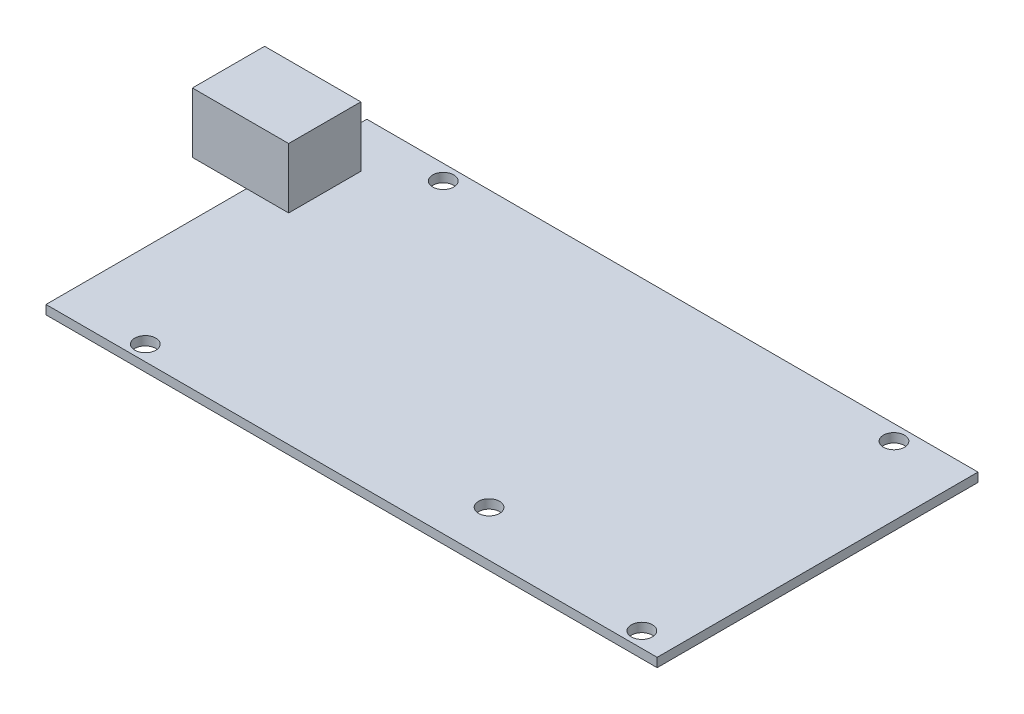
ISO-10303-21;
HEADER;
FILE_DESCRIPTION(('STEP AP214'),'2;1');
FILE_NAME('part.step','',(''),(''),'','','');
FILE_SCHEMA(('AUTOMOTIVE_DESIGN { 1 0 10303 214 1 1 1 1 }'));
ENDSEC;
DATA;
#1=APPLICATION_CONTEXT('core data for automotive mechanical design processes');
#2=APPLICATION_PROTOCOL_DEFINITION('international standard','automotive_design',2000,#1);
#3=PRODUCT_CONTEXT('',#1,'mechanical');
#4=PRODUCT('Part','Part','',(#3));
#5=PRODUCT_RELATED_PRODUCT_CATEGORY('part','',(#4));
#6=PRODUCT_DEFINITION_FORMATION('','',#4);
#7=PRODUCT_DEFINITION_CONTEXT('part definition',#1,'design');
#8=PRODUCT_DEFINITION('design','',#6,#7);
#9=PRODUCT_DEFINITION_SHAPE('','',#8);
#10=(LENGTH_UNIT() NAMED_UNIT(*) SI_UNIT(.MILLI.,.METRE.));
#11=(NAMED_UNIT(*) PLANE_ANGLE_UNIT() SI_UNIT($,.RADIAN.));
#12=(NAMED_UNIT(*) SI_UNIT($,.STERADIAN.) SOLID_ANGLE_UNIT());
#13=UNCERTAINTY_MEASURE_WITH_UNIT(LENGTH_MEASURE(1.E-05),#10,'distance_accuracy_value','');
#14=(GEOMETRIC_REPRESENTATION_CONTEXT(3) GLOBAL_UNCERTAINTY_ASSIGNED_CONTEXT((#13)) GLOBAL_UNIT_ASSIGNED_CONTEXT((#10,
#11,#12)) REPRESENTATION_CONTEXT('',''));
#15=CARTESIAN_POINT('',(0.,0.,0.));
#16=DIRECTION('',(0.,0.,1.));
#17=DIRECTION('',(1.,0.,0.));
#18=AXIS2_PLACEMENT_3D('',#15,#16,#17);
#19=CARTESIAN_POINT('',(0.,1.5,0.));
#20=DIRECTION('',(0.,-1.,0.));
#21=DIRECTION('',(0.,0.,-1.));
#22=AXIS2_PLACEMENT_3D('',#19,#20,#21);
#23=PLANE('',#22);
#24=CARTESIAN_POINT('',(54.1763414634146,1.5,-29.4784552845528));
#25=DIRECTION('',(0.,1.,0.));
#26=DIRECTION('',(0.,0.,1.));
#27=AXIS2_PLACEMENT_3D('',#24,#25,#26);
#28=CIRCLE('',#27,1.75);
#29=CARTESIAN_POINT('',(54.1763414634146,1.5,-27.7284552845528));
#30=VERTEX_POINT('',#29);
#31=EDGE_CURVE('E466',#30,#30,#28,.T.);
#32=ORIENTED_EDGE('',*,*,#31,.F.);
#33=EDGE_LOOP('',(#32));
#34=FACE_BOUND('',#33,.T.);
#35=CARTESIAN_POINT('',(-22.0236585365854,1.5,18.7815447154472));
#36=DIRECTION('',(0.,1.,0.));
#37=DIRECTION('',(0.,0.,1.));
#38=AXIS2_PLACEMENT_3D('',#35,#36,#37);
#39=CIRCLE('',#38,1.75);
#40=CARTESIAN_POINT('',(-22.0236585365854,1.5,20.5315447154472));
#41=VERTEX_POINT('',#40);
#42=EDGE_CURVE('E455',#41,#41,#39,.T.);
#43=ORIENTED_EDGE('',*,*,#42,.F.);
#44=EDGE_LOOP('',(#43));
#45=FACE_BOUND('',#44,.T.);
#46=CARTESIAN_POINT('',(30.0463414634146,1.5,13.7015447154472));
#47=DIRECTION('',(0.,1.,0.));
#48=DIRECTION('',(0.,0.,1.));
#49=AXIS2_PLACEMENT_3D('',#46,#47,#48);
#50=CIRCLE('',#49,1.75);
#51=CARTESIAN_POINT('',(30.0463414634146,1.5,15.4515447154472));
#52=VERTEX_POINT('',#51);
#53=EDGE_CURVE('E451',#52,#52,#50,.T.);
#54=ORIENTED_EDGE('',*,*,#53,.F.);
#55=EDGE_LOOP('',(#54));
#56=FACE_BOUND('',#55,.T.);
#57=CARTESIAN_POINT('',(60.5263414634146,1.5,18.7815447154472));
#58=DIRECTION('',(0.,1.,0.));
#59=DIRECTION('',(0.,0.,1.));
#60=AXIS2_PLACEMENT_3D('',#57,#58,#59);
#61=CIRCLE('',#60,1.75);
#62=CARTESIAN_POINT('',(60.5263414634146,1.5,20.5315447154472));
#63=VERTEX_POINT('',#62);
#64=EDGE_CURVE('E458',#63,#63,#61,.T.);
#65=ORIENTED_EDGE('',*,*,#64,.F.);
#66=EDGE_LOOP('',(#65));
#67=FACE_BOUND('',#66,.T.);
#68=CARTESIAN_POINT('',(-20.7536585365854,1.5,-29.4784552845528));
#69=DIRECTION('',(0.,1.,0.));
#70=DIRECTION('',(0.,0.,1.));
#71=AXIS2_PLACEMENT_3D('',#68,#69,#70);
#72=CIRCLE('',#71,1.75);
#73=CARTESIAN_POINT('',(-20.7536585365854,1.5,-27.7284552845528));
#74=VERTEX_POINT('',#73);
#75=EDGE_CURVE('E200',#74,#74,#72,.T.);
#76=ORIENTED_EDGE('',*,*,#75,.F.);
#77=EDGE_LOOP('',(#76));
#78=FACE_BOUND('',#77,.T.);
#79=DIRECTION('',(1.,0.,0.));
#80=VECTOR('',#79,1.);
#81=CARTESIAN_POINT('',(-44.9936585365854,1.5,-12.0184552845528));
#82=LINE('',#81,#80);
#83=CARTESIAN_POINT('',(-35.9936585365854,1.5,-12.0184552845528));
#84=VERTEX_POINT('',#83);
#85=CARTESIAN_POINT('',(-28.9936585365854,1.5,-12.0184552845528));
#86=VERTEX_POINT('',#85);
#87=EDGE_CURVE('E11',#84,#86,#82,.T.);
#88=ORIENTED_EDGE('',*,*,#87,.F.);
#89=DIRECTION('',(0.,0.,1.));
#90=VECTOR('',#89,1.);
#91=CARTESIAN_POINT('',(-35.9936585365854,1.5,21.3215447154472));
#92=LINE('',#91,#90);
#93=CARTESIAN_POINT('',(-35.9936585365854,1.5,21.3215447154472));
#94=VERTEX_POINT('',#93);
#95=EDGE_CURVE('E294',#84,#94,#92,.T.);
#96=ORIENTED_EDGE('',*,*,#95,.T.);
#97=DIRECTION('',(1.,0.,0.));
#98=VECTOR('',#97,1.);
#99=CARTESIAN_POINT('',(-35.9936585365854,1.5,21.3215447154472));
#100=LINE('',#99,#98);
#101=CARTESIAN_POINT('',(65.6063414634146,1.5,21.3215447154472));
#102=VERTEX_POINT('',#101);
#103=EDGE_CURVE('E292',#94,#102,#100,.T.);
#104=ORIENTED_EDGE('',*,*,#103,.T.);
#105=DIRECTION('',(0.,0.,-1.));
#106=VECTOR('',#105,1.);
#107=CARTESIAN_POINT('',(65.6063414634146,1.5,21.3215447154472));
#108=LINE('',#107,#106);
#109=CARTESIAN_POINT('',(65.6063414634146,1.5,-32.0184552845528));
#110=VERTEX_POINT('',#109);
#111=EDGE_CURVE('E296',#102,#110,#108,.T.);
#112=ORIENTED_EDGE('',*,*,#111,.T.);
#113=DIRECTION('',(-1.,0.,0.));
#114=VECTOR('',#113,1.);
#115=CARTESIAN_POINT('',(-35.9936585365854,1.5,-32.0184552845528));
#116=LINE('',#115,#114);
#117=CARTESIAN_POINT('',(-35.9936585365854,1.5,-32.0184552845528));
#118=VERTEX_POINT('',#117);
#119=EDGE_CURVE('E298',#110,#118,#116,.T.);
#120=ORIENTED_EDGE('',*,*,#119,.T.);
#121=CARTESIAN_POINT('',(-35.9936585365854,1.5,-24.0184552845528));
#122=VERTEX_POINT('',#121);
#123=EDGE_CURVE('E289',#118,#122,#92,.T.);
#124=ORIENTED_EDGE('',*,*,#123,.T.);
#125=DIRECTION('',(1.,0.,0.));
#126=VECTOR('',#125,1.);
#127=CARTESIAN_POINT('',(-44.9936585365854,1.5,-24.0184552845528));
#128=LINE('',#127,#126);
#129=CARTESIAN_POINT('',(-28.9936585365854,1.5,-24.0184552845528));
#130=VERTEX_POINT('',#129);
#131=EDGE_CURVE('E44',#122,#130,#128,.T.);
#132=ORIENTED_EDGE('',*,*,#131,.T.);
#133=DIRECTION('',(0.,0.,1.));
#134=VECTOR('',#133,1.);
#135=CARTESIAN_POINT('',(-28.9936585365854,1.5,-24.0184552845528));
#136=LINE('',#135,#134);
#137=EDGE_CURVE('E273',#130,#86,#136,.T.);
#138=ORIENTED_EDGE('',*,*,#137,.T.);
#139=EDGE_LOOP('',(#88,#96,#104,#112,#120,#124,#132,#138));
#140=FACE_BOUND('',#139,.T.);
#141=ADVANCED_FACE('F35',(#34,#45,#56,#67,#78,#140),#23,.F.);
#142=CARTESIAN_POINT('',(-35.9936585365854,1.5,21.3215447154472));
#143=DIRECTION('',(1.,0.,0.));
#144=DIRECTION('',(0.,0.,-1.));
#145=AXIS2_PLACEMENT_3D('',#142,#143,#144);
#146=PLANE('',#145);
#147=DIRECTION('',(0.,0.,1.));
#148=VECTOR('',#147,1.);
#149=CARTESIAN_POINT('',(-35.9936585365854,0.,21.3215447154472));
#150=LINE('',#149,#148);
#151=CARTESIAN_POINT('',(-35.9936585365854,0.,-32.0184552845528));
#152=VERTEX_POINT('',#151);
#153=CARTESIAN_POINT('',(-35.9936585365854,0.,21.3215447154472));
#154=VERTEX_POINT('',#153);
#155=EDGE_CURVE('E288',#152,#154,#150,.T.);
#156=ORIENTED_EDGE('',*,*,#155,.T.);
#157=DIRECTION('',(0.,-1.,0.));
#158=VECTOR('',#157,1.);
#159=CARTESIAN_POINT('',(-35.9936585365854,1.5,21.3215447154472));
#160=LINE('',#159,#158);
#161=EDGE_CURVE('E39',#94,#154,#160,.T.);
#162=ORIENTED_EDGE('',*,*,#161,.F.);
#163=ORIENTED_EDGE('',*,*,#95,.F.);
#164=EDGE_CURVE('E293',#122,#84,#92,.T.);
#165=ORIENTED_EDGE('',*,*,#164,.F.);
#166=ORIENTED_EDGE('',*,*,#123,.F.);
#167=DIRECTION('',(0.,-1.,0.));
#168=VECTOR('',#167,1.);
#169=CARTESIAN_POINT('',(-35.9936585365854,1.5,-32.0184552845528));
#170=LINE('',#169,#168);
#171=EDGE_CURVE('E300',#118,#152,#170,.T.);
#172=ORIENTED_EDGE('',*,*,#171,.T.);
#173=EDGE_LOOP('',(#156,#162,#163,#165,#166,#172));
#174=FACE_BOUND('',#173,.T.);
#175=ADVANCED_FACE('F37',(#174),#146,.F.);
#176=CARTESIAN_POINT('',(-35.9936585365854,1.5,21.3215447154472));
#177=DIRECTION('',(0.,0.,-1.));
#178=DIRECTION('',(-1.,0.,0.));
#179=AXIS2_PLACEMENT_3D('',#176,#177,#178);
#180=PLANE('',#179);
#181=DIRECTION('',(1.,0.,0.));
#182=VECTOR('',#181,1.);
#183=CARTESIAN_POINT('',(-35.9936585365854,0.,21.3215447154472));
#184=LINE('',#183,#182);
#185=CARTESIAN_POINT('',(65.6063414634146,0.,21.3215447154472));
#186=VERTEX_POINT('',#185);
#187=EDGE_CURVE('E303',#154,#186,#184,.T.);
#188=ORIENTED_EDGE('',*,*,#187,.T.);
#189=DIRECTION('',(0.,-1.,0.));
#190=VECTOR('',#189,1.);
#191=CARTESIAN_POINT('',(65.6063414634146,1.5,21.3215447154472));
#192=LINE('',#191,#190);
#193=EDGE_CURVE('E313',#102,#186,#192,.T.);
#194=ORIENTED_EDGE('',*,*,#193,.F.);
#195=ORIENTED_EDGE('',*,*,#103,.F.);
#196=ORIENTED_EDGE('',*,*,#161,.T.);
#197=EDGE_LOOP('',(#188,#194,#195,#196));
#198=FACE_BOUND('',#197,.T.);
#199=ADVANCED_FACE('F338',(#198),#180,.F.);
#200=CARTESIAN_POINT('',(65.6063414634146,1.5,21.3215447154472));
#201=DIRECTION('',(-1.,0.,0.));
#202=DIRECTION('',(0.,0.,1.));
#203=AXIS2_PLACEMENT_3D('',#200,#201,#202);
#204=PLANE('',#203);
#205=DIRECTION('',(0.,0.,-1.));
#206=VECTOR('',#205,1.);
#207=CARTESIAN_POINT('',(65.6063414634146,0.,21.3215447154472));
#208=LINE('',#207,#206);
#209=CARTESIAN_POINT('',(65.6063414634146,0.,-32.0184552845528));
#210=VERTEX_POINT('',#209);
#211=EDGE_CURVE('E305',#186,#210,#208,.T.);
#212=ORIENTED_EDGE('',*,*,#211,.T.);
#213=DIRECTION('',(0.,-1.,0.));
#214=VECTOR('',#213,1.);
#215=CARTESIAN_POINT('',(65.6063414634146,1.5,-32.0184552845528));
#216=LINE('',#215,#214);
#217=EDGE_CURVE('E311',#110,#210,#216,.T.);
#218=ORIENTED_EDGE('',*,*,#217,.F.);
#219=ORIENTED_EDGE('',*,*,#111,.F.);
#220=ORIENTED_EDGE('',*,*,#193,.T.);
#221=EDGE_LOOP('',(#212,#218,#219,#220));
#222=FACE_BOUND('',#221,.T.);
#223=ADVANCED_FACE('F345',(#222),#204,.F.);
#224=CARTESIAN_POINT('',(-35.9936585365854,1.5,-32.0184552845528));
#225=DIRECTION('',(0.,0.,1.));
#226=DIRECTION('',(1.,0.,0.));
#227=AXIS2_PLACEMENT_3D('',#224,#225,#226);
#228=PLANE('',#227);
#229=DIRECTION('',(-1.,0.,0.));
#230=VECTOR('',#229,1.);
#231=CARTESIAN_POINT('',(-35.9936585365854,0.,-32.0184552845528));
#232=LINE('',#231,#230);
#233=EDGE_CURVE('E307',#210,#152,#232,.T.);
#234=ORIENTED_EDGE('',*,*,#233,.T.);
#235=ORIENTED_EDGE('',*,*,#171,.F.);
#236=ORIENTED_EDGE('',*,*,#119,.F.);
#237=ORIENTED_EDGE('',*,*,#217,.T.);
#238=EDGE_LOOP('',(#234,#235,#236,#237));
#239=FACE_BOUND('',#238,.T.);
#240=ADVANCED_FACE('F348',(#239),#228,.F.);
#241=CARTESIAN_POINT('',(0.,0.,0.));
#242=DIRECTION('',(0.,-1.,0.));
#243=DIRECTION('',(0.,0.,-1.));
#244=AXIS2_PLACEMENT_3D('',#241,#242,#243);
#245=PLANE('',#244);
#246=CARTESIAN_POINT('',(54.1763414634146,0.,-29.4784552845528));
#247=DIRECTION('',(0.,1.,0.));
#248=DIRECTION('',(0.,0.,1.));
#249=AXIS2_PLACEMENT_3D('',#246,#247,#248);
#250=CIRCLE('',#249,1.75);
#251=CARTESIAN_POINT('',(54.1763414634146,0.,-27.7284552845528));
#252=VERTEX_POINT('',#251);
#253=EDGE_CURVE('E463',#252,#252,#250,.T.);
#254=ORIENTED_EDGE('',*,*,#253,.T.);
#255=EDGE_LOOP('',(#254));
#256=FACE_BOUND('',#255,.T.);
#257=CARTESIAN_POINT('',(-22.0236585365854,0.,18.7815447154472));
#258=DIRECTION('',(0.,1.,0.));
#259=DIRECTION('',(0.,0.,1.));
#260=AXIS2_PLACEMENT_3D('',#257,#258,#259);
#261=CIRCLE('',#260,1.75);
#262=CARTESIAN_POINT('',(-22.0236585365854,0.,20.5315447154472));
#263=VERTEX_POINT('',#262);
#264=EDGE_CURVE('E469',#263,#263,#261,.T.);
#265=ORIENTED_EDGE('',*,*,#264,.T.);
#266=EDGE_LOOP('',(#265));
#267=FACE_BOUND('',#266,.T.);
#268=CARTESIAN_POINT('',(30.0463414634146,0.,13.7015447154472));
#269=DIRECTION('',(0.,1.,0.));
#270=DIRECTION('',(0.,0.,1.));
#271=AXIS2_PLACEMENT_3D('',#268,#269,#270);
#272=CIRCLE('',#271,1.75);
#273=CARTESIAN_POINT('',(30.0463414634146,0.,15.4515447154472));
#274=VERTEX_POINT('',#273);
#275=EDGE_CURVE('E448',#274,#274,#272,.T.);
#276=ORIENTED_EDGE('',*,*,#275,.T.);
#277=EDGE_LOOP('',(#276));
#278=FACE_BOUND('',#277,.T.);
#279=CARTESIAN_POINT('',(60.5263414634146,0.,18.7815447154472));
#280=DIRECTION('',(0.,1.,0.));
#281=DIRECTION('',(0.,0.,1.));
#282=AXIS2_PLACEMENT_3D('',#279,#280,#281);
#283=CIRCLE('',#282,1.75);
#284=CARTESIAN_POINT('',(60.5263414634146,0.,20.5315447154472));
#285=VERTEX_POINT('',#284);
#286=EDGE_CURVE('E453',#285,#285,#283,.T.);
#287=ORIENTED_EDGE('',*,*,#286,.T.);
#288=EDGE_LOOP('',(#287));
#289=FACE_BOUND('',#288,.T.);
#290=CARTESIAN_POINT('',(-20.7536585365854,0.,-29.4784552845528));
#291=DIRECTION('',(0.,1.,0.));
#292=DIRECTION('',(0.,0.,1.));
#293=AXIS2_PLACEMENT_3D('',#290,#291,#292);
#294=CIRCLE('',#293,1.75);
#295=CARTESIAN_POINT('',(-20.7536585365854,0.,-27.7284552845528));
#296=VERTEX_POINT('',#295);
#297=EDGE_CURVE('E207',#296,#296,#294,.T.);
#298=ORIENTED_EDGE('',*,*,#297,.T.);
#299=EDGE_LOOP('',(#298));
#300=FACE_BOUND('',#299,.T.);
#301=ORIENTED_EDGE('',*,*,#155,.F.);
#302=ORIENTED_EDGE('',*,*,#233,.F.);
#303=ORIENTED_EDGE('',*,*,#211,.F.);
#304=ORIENTED_EDGE('',*,*,#187,.F.);
#305=EDGE_LOOP('',(#301,#302,#303,#304));
#306=FACE_BOUND('',#305,.T.);
#307=ADVANCED_FACE('F343',(#256,#267,#278,#289,#300,#306),#245,.T.);
#308=CARTESIAN_POINT('',(-44.9936585365854,11.5,-12.0184552845528));
#309=DIRECTION('',(0.,0.,-1.));
#310=DIRECTION('',(-1.,0.,0.));
#311=AXIS2_PLACEMENT_3D('',#308,#309,#310);
#312=PLANE('',#311);
#313=CARTESIAN_POINT('',(-44.9936585365854,1.5,-12.0184552845528));
#314=VERTEX_POINT('',#313);
#315=EDGE_CURVE('E46',#314,#84,#82,.T.);
#316=ORIENTED_EDGE('',*,*,#315,.T.);
#317=ORIENTED_EDGE('',*,*,#87,.T.);
#318=DIRECTION('',(0.,-1.,0.));
#319=VECTOR('',#318,1.);
#320=CARTESIAN_POINT('',(-28.9936585365854,11.5,-12.0184552845528));
#321=LINE('',#320,#319);
#322=CARTESIAN_POINT('',(-28.9936585365854,11.5,-12.0184552845528));
#323=VERTEX_POINT('',#322);
#324=EDGE_CURVE('E286',#323,#86,#321,.T.);
#325=ORIENTED_EDGE('',*,*,#324,.F.);
#326=DIRECTION('',(1.,0.,0.));
#327=VECTOR('',#326,1.);
#328=CARTESIAN_POINT('',(-44.9936585365854,11.5,-12.0184552845528));
#329=LINE('',#328,#327);
#330=CARTESIAN_POINT('',(-44.9936585365854,11.5,-12.0184552845528));
#331=VERTEX_POINT('',#330);
#332=EDGE_CURVE('E260',#331,#323,#329,.T.);
#333=ORIENTED_EDGE('',*,*,#332,.F.);
#334=DIRECTION('',(0.,-1.,0.));
#335=VECTOR('',#334,1.);
#336=CARTESIAN_POINT('',(-44.9936585365854,11.5,-12.0184552845528));
#337=LINE('',#336,#335);
#338=EDGE_CURVE('E270',#331,#314,#337,.T.);
#339=ORIENTED_EDGE('',*,*,#338,.T.);
#340=EDGE_LOOP('',(#316,#317,#325,#333,#339));
#341=FACE_BOUND('',#340,.T.);
#342=ADVANCED_FACE('F355',(#341),#312,.F.);
#343=CARTESIAN_POINT('',(-28.9936585365854,11.5,-24.0184552845528));
#344=DIRECTION('',(1.,0.,0.));
#345=DIRECTION('',(0.,0.,-1.));
#346=AXIS2_PLACEMENT_3D('',#343,#344,#345);
#347=PLANE('',#346);
#348=ORIENTED_EDGE('',*,*,#137,.F.);
#349=DIRECTION('',(0.,-1.,0.));
#350=VECTOR('',#349,1.);
#351=CARTESIAN_POINT('',(-28.9936585365854,11.5,-24.0184552845528));
#352=LINE('',#351,#350);
#353=CARTESIAN_POINT('',(-28.9936585365854,11.5,-24.0184552845528));
#354=VERTEX_POINT('',#353);
#355=EDGE_CURVE('E284',#354,#130,#352,.T.);
#356=ORIENTED_EDGE('',*,*,#355,.F.);
#357=DIRECTION('',(0.,0.,1.));
#358=VECTOR('',#357,1.);
#359=CARTESIAN_POINT('',(-28.9936585365854,11.5,-24.0184552845528));
#360=LINE('',#359,#358);
#361=EDGE_CURVE('E262',#354,#323,#360,.T.);
#362=ORIENTED_EDGE('',*,*,#361,.T.);
#363=ORIENTED_EDGE('',*,*,#324,.T.);
#364=EDGE_LOOP('',(#348,#356,#362,#363));
#365=FACE_BOUND('',#364,.T.);
#366=ADVANCED_FACE('F370',(#365),#347,.T.);
#367=CARTESIAN_POINT('',(-44.9936585365854,11.5,-24.0184552845528));
#368=DIRECTION('',(0.,0.,-1.));
#369=DIRECTION('',(-1.,0.,0.));
#370=AXIS2_PLACEMENT_3D('',#367,#368,#369);
#371=PLANE('',#370);
#372=CARTESIAN_POINT('',(-44.9936585365854,1.5,-24.0184552845528));
#373=VERTEX_POINT('',#372);
#374=EDGE_CURVE('E276',#373,#122,#128,.T.);
#375=ORIENTED_EDGE('',*,*,#374,.F.);
#376=DIRECTION('',(0.,-1.,0.));
#377=VECTOR('',#376,1.);
#378=CARTESIAN_POINT('',(-44.9936585365854,11.5,-24.0184552845528));
#379=LINE('',#378,#377);
#380=CARTESIAN_POINT('',(-44.9936585365854,11.5,-24.0184552845528));
#381=VERTEX_POINT('',#380);
#382=EDGE_CURVE('E282',#381,#373,#379,.T.);
#383=ORIENTED_EDGE('',*,*,#382,.F.);
#384=DIRECTION('',(1.,0.,0.));
#385=VECTOR('',#384,1.);
#386=CARTESIAN_POINT('',(-44.9936585365854,11.5,-24.0184552845528));
#387=LINE('',#386,#385);
#388=EDGE_CURVE('E266',#381,#354,#387,.T.);
#389=ORIENTED_EDGE('',*,*,#388,.T.);
#390=ORIENTED_EDGE('',*,*,#355,.T.);
#391=ORIENTED_EDGE('',*,*,#131,.F.);
#392=EDGE_LOOP('',(#375,#383,#389,#390,#391));
#393=FACE_BOUND('',#392,.T.);
#394=ADVANCED_FACE('F330',(#393),#371,.T.);
#395=CARTESIAN_POINT('',(-44.9936585365854,11.5,-24.0184552845528));
#396=DIRECTION('',(1.,0.,0.));
#397=DIRECTION('',(0.,0.,-1.));
#398=AXIS2_PLACEMENT_3D('',#395,#396,#397);
#399=PLANE('',#398);
#400=DIRECTION('',(0.,0.,1.));
#401=VECTOR('',#400,1.);
#402=CARTESIAN_POINT('',(-44.9936585365854,2.5,-13.0184552845528));
#403=LINE('',#402,#401);
#404=CARTESIAN_POINT('',(-44.9936585365854,2.5,-23.0184552845528));
#405=VERTEX_POINT('',#404);
#406=CARTESIAN_POINT('',(-44.9936585365854,2.5,-13.0184552845528));
#407=VERTEX_POINT('',#406);
#408=EDGE_CURVE('E235',#405,#407,#403,.T.);
#409=ORIENTED_EDGE('',*,*,#408,.F.);
#410=DIRECTION('',(0.,-1.,0.));
#411=VECTOR('',#410,1.);
#412=CARTESIAN_POINT('',(-44.9936585365854,8.5,-23.0184552845528));
#413=LINE('',#412,#411);
#414=CARTESIAN_POINT('',(-44.9936585365854,8.5,-23.0184552845528));
#415=VERTEX_POINT('',#414);
#416=EDGE_CURVE('E53',#415,#405,#413,.T.);
#417=ORIENTED_EDGE('',*,*,#416,.F.);
#418=DIRECTION('',(0.,-0.707106781186547,-0.707106781186548));
#419=VECTOR('',#418,1.);
#420=CARTESIAN_POINT('',(-44.9936585365854,10.5,-21.0184552845528));
#421=LINE('',#420,#419);
#422=CARTESIAN_POINT('',(-44.9936585365854,10.5,-21.0184552845528));
#423=VERTEX_POINT('',#422);
#424=EDGE_CURVE('E218',#423,#415,#421,.T.);
#425=ORIENTED_EDGE('',*,*,#424,.F.);
#426=DIRECTION('',(0.,0.,-1.));
#427=VECTOR('',#426,1.);
#428=CARTESIAN_POINT('',(-44.9936585365854,10.5,-21.0184552845528));
#429=LINE('',#428,#427);
#430=CARTESIAN_POINT('',(-44.9936585365854,10.5,-15.0184552845528));
#431=VERTEX_POINT('',#430);
#432=EDGE_CURVE('E244',#431,#423,#429,.T.);
#433=ORIENTED_EDGE('',*,*,#432,.F.);
#434=DIRECTION('',(0.,0.707106781186548,-0.707106781186548));
#435=VECTOR('',#434,1.);
#436=CARTESIAN_POINT('',(-44.9936585365854,10.5,-15.0184552845528));
#437=LINE('',#436,#435);
#438=CARTESIAN_POINT('',(-44.9936585365854,8.5,-13.0184552845528));
#439=VERTEX_POINT('',#438);
#440=EDGE_CURVE('E241',#439,#431,#437,.T.);
#441=ORIENTED_EDGE('',*,*,#440,.F.);
#442=DIRECTION('',(0.,1.,0.));
#443=VECTOR('',#442,1.);
#444=CARTESIAN_POINT('',(-44.9936585365854,8.5,-13.0184552845528));
#445=LINE('',#444,#443);
#446=EDGE_CURVE('E238',#407,#439,#445,.T.);
#447=ORIENTED_EDGE('',*,*,#446,.F.);
#448=EDGE_LOOP('',(#409,#417,#425,#433,#441,#447));
#449=FACE_BOUND('',#448,.T.);
#450=DIRECTION('',(0.,0.,1.));
#451=VECTOR('',#450,1.);
#452=CARTESIAN_POINT('',(-44.9936585365854,1.5,-24.0184552845528));
#453=LINE('',#452,#451);
#454=EDGE_CURVE('E263',#373,#314,#453,.T.);
#455=ORIENTED_EDGE('',*,*,#454,.T.);
#456=ORIENTED_EDGE('',*,*,#338,.F.);
#457=DIRECTION('',(0.,0.,1.));
#458=VECTOR('',#457,1.);
#459=CARTESIAN_POINT('',(-44.9936585365854,11.5,-24.0184552845528));
#460=LINE('',#459,#458);
#461=EDGE_CURVE('E269',#381,#331,#460,.T.);
#462=ORIENTED_EDGE('',*,*,#461,.F.);
#463=ORIENTED_EDGE('',*,*,#382,.T.);
#464=EDGE_LOOP('',(#455,#456,#462,#463));
#465=FACE_BOUND('',#464,.T.);
#466=ADVANCED_FACE('F377',(#449,#465),#399,.F.);
#467=CARTESIAN_POINT('',(0.,11.5,0.));
#468=DIRECTION('',(0.,-1.,0.));
#469=DIRECTION('',(0.,0.,-1.));
#470=AXIS2_PLACEMENT_3D('',#467,#468,#469);
#471=PLANE('',#470);
#472=ORIENTED_EDGE('',*,*,#332,.T.);
#473=ORIENTED_EDGE('',*,*,#361,.F.);
#474=ORIENTED_EDGE('',*,*,#388,.F.);
#475=ORIENTED_EDGE('',*,*,#461,.T.);
#476=EDGE_LOOP('',(#472,#473,#474,#475));
#477=FACE_BOUND('',#476,.T.);
#478=ADVANCED_FACE('F380',(#477),#471,.F.);
#479=CARTESIAN_POINT('',(0.,1.5,0.));
#480=DIRECTION('',(0.,-1.,0.));
#481=DIRECTION('',(0.,0.,-1.));
#482=AXIS2_PLACEMENT_3D('',#479,#480,#481);
#483=PLANE('',#482);
#484=ORIENTED_EDGE('',*,*,#374,.T.);
#485=ORIENTED_EDGE('',*,*,#164,.T.);
#486=ORIENTED_EDGE('',*,*,#315,.F.);
#487=ORIENTED_EDGE('',*,*,#454,.F.);
#488=EDGE_LOOP('',(#484,#485,#486,#487));
#489=FACE_BOUND('',#488,.T.);
#490=ADVANCED_FACE('F334',(#489),#483,.T.);
#491=CARTESIAN_POINT('',(-34.9936585365854,8.5,-23.0184552845528));
#492=DIRECTION('',(0.,0.,-1.));
#493=DIRECTION('',(-1.,0.,0.));
#494=AXIS2_PLACEMENT_3D('',#491,#492,#493);
#495=PLANE('',#494);
#496=ORIENTED_EDGE('',*,*,#416,.T.);
#497=DIRECTION('',(-1.,0.,0.));
#498=VECTOR('',#497,1.);
#499=CARTESIAN_POINT('',(-34.9936585365854,2.5,-23.0184552845528));
#500=LINE('',#499,#498);
#501=CARTESIAN_POINT('',(-34.9936585365854,2.5,-23.0184552845528));
#502=VERTEX_POINT('',#501);
#503=EDGE_CURVE('E233',#502,#405,#500,.T.);
#504=ORIENTED_EDGE('',*,*,#503,.F.);
#505=DIRECTION('',(0.,-1.,0.));
#506=VECTOR('',#505,1.);
#507=CARTESIAN_POINT('',(-34.9936585365854,8.5,-23.0184552845528));
#508=LINE('',#507,#506);
#509=CARTESIAN_POINT('',(-34.9936585365854,8.5,-23.0184552845528));
#510=VERTEX_POINT('',#509);
#511=EDGE_CURVE('E214',#510,#502,#508,.T.);
#512=ORIENTED_EDGE('',*,*,#511,.F.);
#513=DIRECTION('',(-1.,0.,0.));
#514=VECTOR('',#513,1.);
#515=CARTESIAN_POINT('',(-34.9936585365854,8.5,-23.0184552845528));
#516=LINE('',#515,#514);
#517=EDGE_CURVE('E249',#510,#415,#516,.T.);
#518=ORIENTED_EDGE('',*,*,#517,.T.);
#519=EDGE_LOOP('',(#496,#504,#512,#518));
#520=FACE_BOUND('',#519,.T.);
#521=ADVANCED_FACE('F385',(#520),#495,.F.);
#522=CARTESIAN_POINT('',(-34.9936585365854,10.5,-21.0184552845528));
#523=DIRECTION('',(0.,0.707106781186548,-0.707106781186547));
#524=DIRECTION('',(0.,0.707106781186547,0.707106781186548));
#525=AXIS2_PLACEMENT_3D('',#522,#523,#524);
#526=PLANE('',#525);
#527=ORIENTED_EDGE('',*,*,#424,.T.);
#528=ORIENTED_EDGE('',*,*,#517,.F.);
#529=DIRECTION('',(0.,-0.707106781186547,-0.707106781186548));
#530=VECTOR('',#529,1.);
#531=CARTESIAN_POINT('',(-34.9936585365854,10.5,-21.0184552845528));
#532=LINE('',#531,#530);
#533=CARTESIAN_POINT('',(-34.9936585365854,10.5,-21.0184552845528));
#534=VERTEX_POINT('',#533);
#535=EDGE_CURVE('E230',#534,#510,#532,.T.);
#536=ORIENTED_EDGE('',*,*,#535,.F.);
#537=DIRECTION('',(-1.,0.,0.));
#538=VECTOR('',#537,1.);
#539=CARTESIAN_POINT('',(-34.9936585365854,10.5,-21.0184552845528));
#540=LINE('',#539,#538);
#541=EDGE_CURVE('E251',#534,#423,#540,.T.);
#542=ORIENTED_EDGE('',*,*,#541,.T.);
#543=EDGE_LOOP('',(#527,#528,#536,#542));
#544=FACE_BOUND('',#543,.T.);
#545=ADVANCED_FACE('F391',(#544),#526,.F.);
#546=CARTESIAN_POINT('',(-34.9936585365854,10.5,-21.0184552845528));
#547=DIRECTION('',(0.,1.,0.));
#548=DIRECTION('',(0.,0.,1.));
#549=AXIS2_PLACEMENT_3D('',#546,#547,#548);
#550=PLANE('',#549);
#551=ORIENTED_EDGE('',*,*,#432,.T.);
#552=ORIENTED_EDGE('',*,*,#541,.F.);
#553=DIRECTION('',(0.,0.,-1.));
#554=VECTOR('',#553,1.);
#555=CARTESIAN_POINT('',(-34.9936585365854,10.5,-21.0184552845528));
#556=LINE('',#555,#554);
#557=CARTESIAN_POINT('',(-34.9936585365854,10.5,-15.0184552845528));
#558=VERTEX_POINT('',#557);
#559=EDGE_CURVE('E227',#558,#534,#556,.T.);
#560=ORIENTED_EDGE('',*,*,#559,.F.);
#561=DIRECTION('',(-1.,0.,0.));
#562=VECTOR('',#561,1.);
#563=CARTESIAN_POINT('',(-34.9936585365854,10.5,-15.0184552845528));
#564=LINE('',#563,#562);
#565=EDGE_CURVE('E253',#558,#431,#564,.T.);
#566=ORIENTED_EDGE('',*,*,#565,.T.);
#567=EDGE_LOOP('',(#551,#552,#560,#566));
#568=FACE_BOUND('',#567,.T.);
#569=ADVANCED_FACE('F403',(#568),#550,.F.);
#570=CARTESIAN_POINT('',(-34.9936585365854,10.5,-15.0184552845528));
#571=DIRECTION('',(0.,0.707106781186548,0.707106781186548));
#572=DIRECTION('',(0.,-0.707106781186548,0.707106781186548));
#573=AXIS2_PLACEMENT_3D('',#570,#571,#572);
#574=PLANE('',#573);
#575=ORIENTED_EDGE('',*,*,#440,.T.);
#576=ORIENTED_EDGE('',*,*,#565,.F.);
#577=DIRECTION('',(0.,0.707106781186548,-0.707106781186548));
#578=VECTOR('',#577,1.);
#579=CARTESIAN_POINT('',(-34.9936585365854,10.5,-15.0184552845528));
#580=LINE('',#579,#578);
#581=CARTESIAN_POINT('',(-34.9936585365854,8.5,-13.0184552845528));
#582=VERTEX_POINT('',#581);
#583=EDGE_CURVE('E224',#582,#558,#580,.T.);
#584=ORIENTED_EDGE('',*,*,#583,.F.);
#585=DIRECTION('',(-1.,0.,0.));
#586=VECTOR('',#585,1.);
#587=CARTESIAN_POINT('',(-34.9936585365854,8.5,-13.0184552845528));
#588=LINE('',#587,#586);
#589=EDGE_CURVE('E255',#582,#439,#588,.T.);
#590=ORIENTED_EDGE('',*,*,#589,.T.);
#591=EDGE_LOOP('',(#575,#576,#584,#590));
#592=FACE_BOUND('',#591,.T.);
#593=ADVANCED_FACE('F399',(#592),#574,.F.);
#594=CARTESIAN_POINT('',(-34.9936585365854,8.5,-13.0184552845528));
#595=DIRECTION('',(0.,0.,1.));
#596=DIRECTION('',(1.,0.,0.));
#597=AXIS2_PLACEMENT_3D('',#594,#595,#596);
#598=PLANE('',#597);
#599=ORIENTED_EDGE('',*,*,#446,.T.);
#600=ORIENTED_EDGE('',*,*,#589,.F.);
#601=DIRECTION('',(0.,1.,0.));
#602=VECTOR('',#601,1.);
#603=CARTESIAN_POINT('',(-34.9936585365854,8.5,-13.0184552845528));
#604=LINE('',#603,#602);
#605=CARTESIAN_POINT('',(-34.9936585365854,2.5,-13.0184552845528));
#606=VERTEX_POINT('',#605);
#607=EDGE_CURVE('E221',#606,#582,#604,.T.);
#608=ORIENTED_EDGE('',*,*,#607,.F.);
#609=DIRECTION('',(-1.,0.,0.));
#610=VECTOR('',#609,1.);
#611=CARTESIAN_POINT('',(-34.9936585365854,2.5,-13.0184552845528));
#612=LINE('',#611,#610);
#613=EDGE_CURVE('E257',#606,#407,#612,.T.);
#614=ORIENTED_EDGE('',*,*,#613,.T.);
#615=EDGE_LOOP('',(#599,#600,#608,#614));
#616=FACE_BOUND('',#615,.T.);
#617=ADVANCED_FACE('F395',(#616),#598,.F.);
#618=CARTESIAN_POINT('',(-34.9936585365854,2.5,-13.0184552845528));
#619=DIRECTION('',(0.,-1.,0.));
#620=DIRECTION('',(0.,0.,-1.));
#621=AXIS2_PLACEMENT_3D('',#618,#619,#620);
#622=PLANE('',#621);
#623=ORIENTED_EDGE('',*,*,#408,.T.);
#624=ORIENTED_EDGE('',*,*,#613,.F.);
#625=DIRECTION('',(0.,0.,1.));
#626=VECTOR('',#625,1.);
#627=CARTESIAN_POINT('',(-34.9936585365854,2.5,-13.0184552845528));
#628=LINE('',#627,#626);
#629=EDGE_CURVE('E217',#502,#606,#628,.T.);
#630=ORIENTED_EDGE('',*,*,#629,.F.);
#631=ORIENTED_EDGE('',*,*,#503,.T.);
#632=EDGE_LOOP('',(#623,#624,#630,#631));
#633=FACE_BOUND('',#632,.T.);
#634=ADVANCED_FACE('F392',(#633),#622,.F.);
#635=CARTESIAN_POINT('',(-34.9936585365854,0.,0.));
#636=DIRECTION('',(1.,0.,0.));
#637=DIRECTION('',(0.,0.,-1.));
#638=AXIS2_PLACEMENT_3D('',#635,#636,#637);
#639=PLANE('',#638);
#640=DIRECTION('',(0.,-1.,0.));
#641=VECTOR('',#640,1.);
#642=CARTESIAN_POINT('',(-34.9936585365854,7.55307458384003,-21.0184552845528));
#643=LINE('',#642,#641);
#644=CARTESIAN_POINT('',(-34.9936585365854,7.55307458384003,-21.0184552845528));
#645=VERTEX_POINT('',#644);
#646=CARTESIAN_POINT('',(-34.9936585365854,5.38957956530696,-21.0184552845528));
#647=VERTEX_POINT('',#646);
#648=EDGE_CURVE('E188',#645,#647,#643,.T.);
#649=ORIENTED_EDGE('',*,*,#648,.F.);
#650=DIRECTION('',(0.,0.,-1.));
#651=VECTOR('',#650,1.);
#652=CARTESIAN_POINT('',(-34.9936585365854,7.55307458384003,-21.0184552845528));
#653=LINE('',#652,#651);
#654=CARTESIAN_POINT('',(-34.9936585365854,7.55307458384003,-15.0184552845528));
#655=VERTEX_POINT('',#654);
#656=EDGE_CURVE('E181',#655,#645,#653,.T.);
#657=ORIENTED_EDGE('',*,*,#656,.F.);
#658=DIRECTION('',(0.,1.,0.));
#659=VECTOR('',#658,1.);
#660=CARTESIAN_POINT('',(-34.9936585365854,7.55307458384003,-15.0184552845528));
#661=LINE('',#660,#659);
#662=CARTESIAN_POINT('',(-34.9936585365854,5.38957956530696,-15.0184552845528));
#663=VERTEX_POINT('',#662);
#664=EDGE_CURVE('E191',#663,#655,#661,.T.);
#665=ORIENTED_EDGE('',*,*,#664,.F.);
#666=DIRECTION('',(0.,0.,1.));
#667=VECTOR('',#666,1.);
#668=CARTESIAN_POINT('',(-34.9936585365854,5.38957956530696,-21.0184552845528));
#669=LINE('',#668,#667);
#670=EDGE_CURVE('E173',#647,#663,#669,.T.);
#671=ORIENTED_EDGE('',*,*,#670,.F.);
#672=EDGE_LOOP('',(#649,#657,#665,#671));
#673=FACE_BOUND('',#672,.T.);
#674=ORIENTED_EDGE('',*,*,#511,.T.);
#675=ORIENTED_EDGE('',*,*,#629,.T.);
#676=ORIENTED_EDGE('',*,*,#607,.T.);
#677=ORIENTED_EDGE('',*,*,#583,.T.);
#678=ORIENTED_EDGE('',*,*,#559,.T.);
#679=ORIENTED_EDGE('',*,*,#535,.T.);
#680=EDGE_LOOP('',(#674,#675,#676,#677,#678,#679));
#681=FACE_BOUND('',#680,.T.);
#682=ADVANCED_FACE('F185',(#673,#681),#639,.F.);
#683=CARTESIAN_POINT('',(-34.9936585365854,7.55307458384003,-21.0184552845528));
#684=DIRECTION('',(0.,0.,-1.));
#685=DIRECTION('',(-1.,0.,0.));
#686=AXIS2_PLACEMENT_3D('',#683,#684,#685);
#687=PLANE('',#686);
#688=DIRECTION('',(0.,-1.,0.));
#689=VECTOR('',#688,1.);
#690=CARTESIAN_POINT('',(-44.9936585365854,7.55307458384003,-21.0184552845528));
#691=LINE('',#690,#689);
#692=CARTESIAN_POINT('',(-44.9936585365854,7.55307458384003,-21.0184552845528));
#693=VERTEX_POINT('',#692);
#694=CARTESIAN_POINT('',(-44.9936585365854,5.38957956530696,-21.0184552845528));
#695=VERTEX_POINT('',#694);
#696=EDGE_CURVE('E205',#693,#695,#691,.T.);
#697=ORIENTED_EDGE('',*,*,#696,.F.);
#698=DIRECTION('',(-1.,0.,0.));
#699=VECTOR('',#698,1.);
#700=CARTESIAN_POINT('',(-34.9936585365854,7.55307458384003,-21.0184552845528));
#701=LINE('',#700,#699);
#702=EDGE_CURVE('E194',#645,#693,#701,.T.);
#703=ORIENTED_EDGE('',*,*,#702,.F.);
#704=ORIENTED_EDGE('',*,*,#648,.T.);
#705=DIRECTION('',(-1.,0.,0.));
#706=VECTOR('',#705,1.);
#707=CARTESIAN_POINT('',(-34.9936585365854,5.38957956530696,-21.0184552845528));
#708=LINE('',#707,#706);
#709=EDGE_CURVE('E170',#647,#695,#708,.T.);
#710=ORIENTED_EDGE('',*,*,#709,.T.);
#711=EDGE_LOOP('',(#697,#703,#704,#710));
#712=FACE_BOUND('',#711,.T.);
#713=ADVANCED_FACE('F193',(#712),#687,.T.);
#714=CARTESIAN_POINT('',(-34.9936585365854,7.55307458384003,-21.0184552845528));
#715=DIRECTION('',(0.,1.,0.));
#716=DIRECTION('',(0.,0.,1.));
#717=AXIS2_PLACEMENT_3D('',#714,#715,#716);
#718=PLANE('',#717);
#719=DIRECTION('',(0.,0.,-1.));
#720=VECTOR('',#719,1.);
#721=CARTESIAN_POINT('',(-44.9936585365854,7.55307458384003,-21.0184552845528));
#722=LINE('',#721,#720);
#723=CARTESIAN_POINT('',(-44.9936585365854,7.55307458384003,-15.0184552845528));
#724=VERTEX_POINT('',#723);
#725=EDGE_CURVE('E195',#724,#693,#722,.T.);
#726=ORIENTED_EDGE('',*,*,#725,.F.);
#727=DIRECTION('',(-1.,0.,0.));
#728=VECTOR('',#727,1.);
#729=CARTESIAN_POINT('',(-34.9936585365854,7.55307458384003,-15.0184552845528));
#730=LINE('',#729,#728);
#731=EDGE_CURVE('E211',#655,#724,#730,.T.);
#732=ORIENTED_EDGE('',*,*,#731,.F.);
#733=ORIENTED_EDGE('',*,*,#656,.T.);
#734=ORIENTED_EDGE('',*,*,#702,.T.);
#735=EDGE_LOOP('',(#726,#732,#733,#734));
#736=FACE_BOUND('',#735,.T.);
#737=ADVANCED_FACE('F415',(#736),#718,.T.);
#738=CARTESIAN_POINT('',(-34.9936585365854,7.55307458384003,-15.0184552845528));
#739=DIRECTION('',(0.,0.,1.));
#740=DIRECTION('',(1.,0.,0.));
#741=AXIS2_PLACEMENT_3D('',#738,#739,#740);
#742=PLANE('',#741);
#743=DIRECTION('',(0.,1.,0.));
#744=VECTOR('',#743,1.);
#745=CARTESIAN_POINT('',(-44.9936585365854,7.55307458384003,-15.0184552845528));
#746=LINE('',#745,#744);
#747=CARTESIAN_POINT('',(-44.9936585365854,5.38957956530696,-15.0184552845528));
#748=VERTEX_POINT('',#747);
#749=EDGE_CURVE('E61',#748,#724,#746,.T.);
#750=ORIENTED_EDGE('',*,*,#749,.F.);
#751=DIRECTION('',(-1.,0.,0.));
#752=VECTOR('',#751,1.);
#753=CARTESIAN_POINT('',(-34.9936585365854,5.38957956530696,-15.0184552845528));
#754=LINE('',#753,#752);
#755=EDGE_CURVE('E180',#663,#748,#754,.T.);
#756=ORIENTED_EDGE('',*,*,#755,.F.);
#757=ORIENTED_EDGE('',*,*,#664,.T.);
#758=ORIENTED_EDGE('',*,*,#731,.T.);
#759=EDGE_LOOP('',(#750,#756,#757,#758));
#760=FACE_BOUND('',#759,.T.);
#761=ADVANCED_FACE('F418',(#760),#742,.T.);
#762=CARTESIAN_POINT('',(-34.9936585365854,5.38957956530696,-21.0184552845528));
#763=DIRECTION('',(0.,-1.,0.));
#764=DIRECTION('',(0.,0.,-1.));
#765=AXIS2_PLACEMENT_3D('',#762,#763,#764);
#766=PLANE('',#765);
#767=DIRECTION('',(0.,0.,1.));
#768=VECTOR('',#767,1.);
#769=CARTESIAN_POINT('',(-44.9936585365854,5.38957956530696,-21.0184552845528));
#770=LINE('',#769,#768);
#771=EDGE_CURVE('E175',#695,#748,#770,.T.);
#772=ORIENTED_EDGE('',*,*,#771,.F.);
#773=ORIENTED_EDGE('',*,*,#709,.F.);
#774=ORIENTED_EDGE('',*,*,#670,.T.);
#775=ORIENTED_EDGE('',*,*,#755,.T.);
#776=EDGE_LOOP('',(#772,#773,#774,#775));
#777=FACE_BOUND('',#776,.T.);
#778=ADVANCED_FACE('F172',(#777),#766,.T.);
#779=ORIENTED_EDGE('',*,*,#696,.T.);
#780=ORIENTED_EDGE('',*,*,#771,.T.);
#781=ORIENTED_EDGE('',*,*,#749,.T.);
#782=ORIENTED_EDGE('',*,*,#725,.T.);
#783=EDGE_LOOP('',(#779,#780,#781,#782));
#784=FACE_BOUND('',#783,.T.);
#785=ADVANCED_FACE('F382',(#784),#399,.F.);
#786=CARTESIAN_POINT('',(-20.7536585365854,0.,-29.4784552845528));
#787=DIRECTION('',(0.,1.,0.));
#788=DIRECTION('',(0.,0.,1.));
#789=AXIS2_PLACEMENT_3D('',#786,#787,#788);
#790=CYLINDRICAL_SURFACE('',#789,1.75);
#791=ORIENTED_EDGE('',*,*,#297,.F.);
#792=EDGE_LOOP('',(#791));
#793=FACE_BOUND('',#792,.T.);
#794=ORIENTED_EDGE('',*,*,#75,.T.);
#795=EDGE_LOOP('',(#794));
#796=FACE_BOUND('',#795,.T.);
#797=ADVANCED_FACE('F424',(#793,#796),#790,.F.);
#798=CARTESIAN_POINT('',(60.5263414634146,0.,18.7815447154472));
#799=DIRECTION('',(0.,1.,0.));
#800=DIRECTION('',(0.,0.,1.));
#801=AXIS2_PLACEMENT_3D('',#798,#799,#800);
#802=CYLINDRICAL_SURFACE('',#801,1.75);
#803=ORIENTED_EDGE('',*,*,#286,.F.);
#804=EDGE_LOOP('',(#803));
#805=FACE_BOUND('',#804,.T.);
#806=ORIENTED_EDGE('',*,*,#64,.T.);
#807=EDGE_LOOP('',(#806));
#808=FACE_BOUND('',#807,.T.);
#809=ADVANCED_FACE('F427',(#805,#808),#802,.F.);
#810=CARTESIAN_POINT('',(30.0463414634146,0.,13.7015447154472));
#811=DIRECTION('',(0.,1.,0.));
#812=DIRECTION('',(0.,0.,1.));
#813=AXIS2_PLACEMENT_3D('',#810,#811,#812);
#814=CYLINDRICAL_SURFACE('',#813,1.75);
#815=ORIENTED_EDGE('',*,*,#275,.F.);
#816=EDGE_LOOP('',(#815));
#817=FACE_BOUND('',#816,.T.);
#818=ORIENTED_EDGE('',*,*,#53,.T.);
#819=EDGE_LOOP('',(#818));
#820=FACE_BOUND('',#819,.T.);
#821=ADVANCED_FACE('F433',(#817,#820),#814,.F.);
#822=CARTESIAN_POINT('',(-22.0236585365854,0.,18.7815447154472));
#823=DIRECTION('',(0.,1.,0.));
#824=DIRECTION('',(0.,0.,1.));
#825=AXIS2_PLACEMENT_3D('',#822,#823,#824);
#826=CYLINDRICAL_SURFACE('',#825,1.75);
#827=ORIENTED_EDGE('',*,*,#264,.F.);
#828=EDGE_LOOP('',(#827));
#829=FACE_BOUND('',#828,.T.);
#830=ORIENTED_EDGE('',*,*,#42,.T.);
#831=EDGE_LOOP('',(#830));
#832=FACE_BOUND('',#831,.T.);
#833=ADVANCED_FACE('F429',(#829,#832),#826,.F.);
#834=CARTESIAN_POINT('',(54.1763414634146,0.,-29.4784552845528));
#835=DIRECTION('',(0.,1.,0.));
#836=DIRECTION('',(0.,0.,1.));
#837=AXIS2_PLACEMENT_3D('',#834,#835,#836);
#838=CYLINDRICAL_SURFACE('',#837,1.75);
#839=ORIENTED_EDGE('',*,*,#253,.F.);
#840=EDGE_LOOP('',(#839));
#841=FACE_BOUND('',#840,.T.);
#842=ORIENTED_EDGE('',*,*,#31,.T.);
#843=EDGE_LOOP('',(#842));
#844=FACE_BOUND('',#843,.T.);
#845=ADVANCED_FACE('F432',(#841,#844),#838,.F.);
#846=CLOSED_SHELL('',(#141,#175,#199,#223,#240,#307,#342,#366,#394,#466,#478,#490,#521,#545,
#569,#593,#617,#634,#682,#713,#737,#761,#778,#785,#797,#809,#821,#833,#845));
#847=MANIFOLD_SOLID_BREP('B2',#846);
#848=ADVANCED_BREP_SHAPE_REPRESENTATION('',(#18,#847),#14);
#849=SHAPE_DEFINITION_REPRESENTATION(#9,#848);
ENDSEC;
END-ISO-10303-21;
